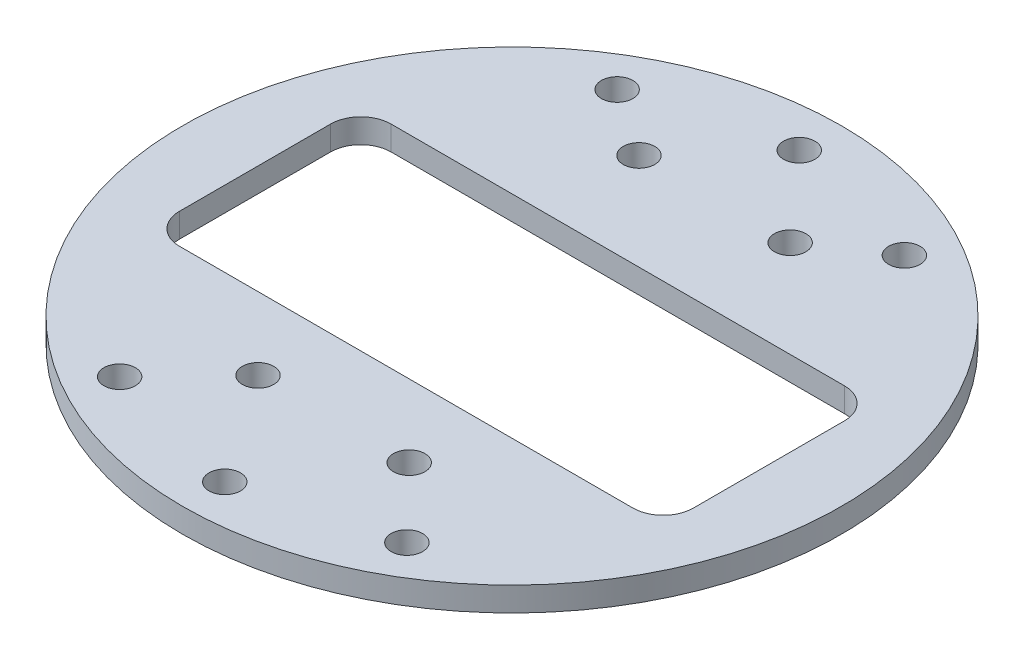
ISO-10303-21;
HEADER;
FILE_DESCRIPTION(('STEP AP214'),'2;1');
FILE_NAME('part.step','',(''),(''),'','','');
FILE_SCHEMA(('AUTOMOTIVE_DESIGN { 1 0 10303 214 1 1 1 1 }'));
ENDSEC;
DATA;
#1=APPLICATION_CONTEXT('core data for automotive mechanical design processes');
#2=APPLICATION_PROTOCOL_DEFINITION('international standard','automotive_design',2000,#1);
#3=PRODUCT_CONTEXT('',#1,'mechanical');
#4=PRODUCT('Part','Part','',(#3));
#5=PRODUCT_RELATED_PRODUCT_CATEGORY('part','',(#4));
#6=PRODUCT_DEFINITION_FORMATION('','',#4);
#7=PRODUCT_DEFINITION_CONTEXT('part definition',#1,'design');
#8=PRODUCT_DEFINITION('design','',#6,#7);
#9=PRODUCT_DEFINITION_SHAPE('','',#8);
#10=(LENGTH_UNIT() NAMED_UNIT(*) SI_UNIT(.MILLI.,.METRE.));
#11=(NAMED_UNIT(*) PLANE_ANGLE_UNIT() SI_UNIT($,.RADIAN.));
#12=(NAMED_UNIT(*) SI_UNIT($,.STERADIAN.) SOLID_ANGLE_UNIT());
#13=UNCERTAINTY_MEASURE_WITH_UNIT(LENGTH_MEASURE(1.E-05),#10,'distance_accuracy_value','');
#14=(GEOMETRIC_REPRESENTATION_CONTEXT(3) GLOBAL_UNCERTAINTY_ASSIGNED_CONTEXT((#13)) GLOBAL_UNIT_ASSIGNED_CONTEXT((#10,
#11,#12)) REPRESENTATION_CONTEXT('',''));
#15=CARTESIAN_POINT('',(0.,0.,0.));
#16=DIRECTION('',(0.,0.,1.));
#17=DIRECTION('',(1.,0.,0.));
#18=AXIS2_PLACEMENT_3D('',#15,#16,#17);
#19=CARTESIAN_POINT('',(0.,4.,0.));
#20=DIRECTION('',(0.,-1.,0.));
#21=DIRECTION('',(0.,0.,-1.));
#22=AXIS2_PLACEMENT_3D('',#19,#20,#21);
#23=CYLINDRICAL_SURFACE('',#22,54.5);
#24=CARTESIAN_POINT('',(0.,4.,0.));
#25=DIRECTION('',(0.,1.,0.));
#26=DIRECTION('',(0.,0.,1.));
#27=AXIS2_PLACEMENT_3D('',#24,#25,#26);
#28=CIRCLE('',#27,54.5);
#29=CARTESIAN_POINT('',(0.,4.,54.5));
#30=VERTEX_POINT('',#29);
#31=EDGE_CURVE('E139',#30,#30,#28,.T.);
#32=ORIENTED_EDGE('',*,*,#31,.F.);
#33=EDGE_LOOP('',(#32));
#34=FACE_BOUND('',#33,.T.);
#35=CARTESIAN_POINT('',(0.,0.,0.));
#36=DIRECTION('',(0.,1.,0.));
#37=DIRECTION('',(0.,0.,1.));
#38=AXIS2_PLACEMENT_3D('',#35,#36,#37);
#39=CIRCLE('',#38,54.5);
#40=CARTESIAN_POINT('',(0.,0.,54.5));
#41=VERTEX_POINT('',#40);
#42=EDGE_CURVE('E142',#41,#41,#39,.T.);
#43=ORIENTED_EDGE('',*,*,#42,.T.);
#44=EDGE_LOOP('',(#43));
#45=FACE_BOUND('',#44,.T.);
#46=ADVANCED_FACE('F38',(#34,#45),#23,.T.);
#47=CARTESIAN_POINT('',(0.,4.,0.));
#48=DIRECTION('',(0.,1.,0.));
#49=DIRECTION('',(0.,0.,1.));
#50=AXIS2_PLACEMENT_3D('',#47,#48,#49);
#51=PLANE('',#50);
#52=CARTESIAN_POINT('',(-12.5,4.,-33.5));
#53=DIRECTION('',(0.,1.,0.));
#54=DIRECTION('',(0.,0.,1.));
#55=AXIS2_PLACEMENT_3D('',#52,#53,#54);
#56=CIRCLE('',#55,2.6);
#57=CARTESIAN_POINT('',(-12.5,4.,-30.9));
#58=VERTEX_POINT('',#57);
#59=EDGE_CURVE('E236',#58,#58,#56,.T.);
#60=ORIENTED_EDGE('',*,*,#59,.F.);
#61=EDGE_LOOP('',(#60));
#62=FACE_BOUND('',#61,.T.);
#63=CARTESIAN_POINT('',(12.5,4.,-33.5));
#64=DIRECTION('',(0.,1.,0.));
#65=DIRECTION('',(0.,0.,1.));
#66=AXIS2_PLACEMENT_3D('',#63,#64,#65);
#67=CIRCLE('',#66,2.6);
#68=CARTESIAN_POINT('',(12.5,4.,-30.9));
#69=VERTEX_POINT('',#68);
#70=EDGE_CURVE('E241',#69,#69,#67,.T.);
#71=ORIENTED_EDGE('',*,*,#70,.F.);
#72=EDGE_LOOP('',(#71));
#73=FACE_BOUND('',#72,.T.);
#74=CARTESIAN_POINT('',(-12.5000000000001,4.,29.5));
#75=DIRECTION('',(0.,1.,0.));
#76=DIRECTION('',(0.,0.,1.));
#77=AXIS2_PLACEMENT_3D('',#74,#75,#76);
#78=CIRCLE('',#77,2.6);
#79=CARTESIAN_POINT('',(-12.5000000000001,4.,32.1));
#80=VERTEX_POINT('',#79);
#81=EDGE_CURVE('E222',#80,#80,#78,.T.);
#82=ORIENTED_EDGE('',*,*,#81,.F.);
#83=EDGE_LOOP('',(#82));
#84=FACE_BOUND('',#83,.T.);
#85=CARTESIAN_POINT('',(12.4999999999999,4.,29.5));
#86=DIRECTION('',(0.,1.,0.));
#87=DIRECTION('',(0.,0.,1.));
#88=AXIS2_PLACEMENT_3D('',#85,#86,#87);
#89=CIRCLE('',#88,2.6);
#90=CARTESIAN_POINT('',(12.4999999999999,4.,32.1));
#91=VERTEX_POINT('',#90);
#92=EDGE_CURVE('E229',#91,#91,#89,.T.);
#93=ORIENTED_EDGE('',*,*,#92,.F.);
#94=EDGE_LOOP('',(#93));
#95=FACE_BOUND('',#94,.T.);
#96=CARTESIAN_POINT('',(23.7499999999999,4.,-41.1362066797609));
#97=DIRECTION('',(0.,1.,0.));
#98=DIRECTION('',(0.,0.,1.));
#99=AXIS2_PLACEMENT_3D('',#96,#97,#98);
#100=CIRCLE('',#99,2.6);
#101=CARTESIAN_POINT('',(23.7499999999999,4.,-38.5362066797609));
#102=VERTEX_POINT('',#101);
#103=EDGE_CURVE('E204',#102,#102,#100,.T.);
#104=ORIENTED_EDGE('',*,*,#103,.F.);
#105=EDGE_LOOP('',(#104));
#106=FACE_BOUND('',#105,.T.);
#107=CARTESIAN_POINT('',(0.,4.,-47.5));
#108=DIRECTION('',(0.,1.,0.));
#109=DIRECTION('',(0.,0.,1.));
#110=AXIS2_PLACEMENT_3D('',#107,#108,#109);
#111=CIRCLE('',#110,2.6);
#112=CARTESIAN_POINT('',(0.,4.,-44.9));
#113=VERTEX_POINT('',#112);
#114=EDGE_CURVE('E211',#113,#113,#111,.T.);
#115=ORIENTED_EDGE('',*,*,#114,.F.);
#116=EDGE_LOOP('',(#115));
#117=FACE_BOUND('',#116,.T.);
#118=CARTESIAN_POINT('',(-23.7499999999999,4.,-41.1362066797609));
#119=DIRECTION('',(0.,1.,0.));
#120=DIRECTION('',(0.,0.,1.));
#121=AXIS2_PLACEMENT_3D('',#118,#119,#120);
#122=CIRCLE('',#121,2.6);
#123=CARTESIAN_POINT('',(-23.7499999999999,4.,-38.5362066797609));
#124=VERTEX_POINT('',#123);
#125=EDGE_CURVE('E214',#124,#124,#122,.T.);
#126=ORIENTED_EDGE('',*,*,#125,.F.);
#127=EDGE_LOOP('',(#126));
#128=FACE_BOUND('',#127,.T.);
#129=CARTESIAN_POINT('',(-23.7499999999999,4.,41.1362066797609));
#130=DIRECTION('',(0.,1.,0.));
#131=DIRECTION('',(0.,0.,1.));
#132=AXIS2_PLACEMENT_3D('',#129,#130,#131);
#133=CIRCLE('',#132,2.6);
#134=CARTESIAN_POINT('',(-23.7499999999999,4.,43.7362066797609));
#135=VERTEX_POINT('',#134);
#136=EDGE_CURVE('E187',#135,#135,#133,.T.);
#137=ORIENTED_EDGE('',*,*,#136,.F.);
#138=EDGE_LOOP('',(#137));
#139=FACE_BOUND('',#138,.T.);
#140=CARTESIAN_POINT('',(0.,4.,47.5));
#141=DIRECTION('',(0.,1.,0.));
#142=DIRECTION('',(0.,0.,1.));
#143=AXIS2_PLACEMENT_3D('',#140,#141,#142);
#144=CIRCLE('',#143,2.6);
#145=CARTESIAN_POINT('',(0.,4.,50.1));
#146=VERTEX_POINT('',#145);
#147=EDGE_CURVE('E189',#146,#146,#144,.T.);
#148=ORIENTED_EDGE('',*,*,#147,.F.);
#149=EDGE_LOOP('',(#148));
#150=FACE_BOUND('',#149,.T.);
#151=CARTESIAN_POINT('',(23.7499999999999,4.,41.1362066797609));
#152=DIRECTION('',(0.,1.,0.));
#153=DIRECTION('',(0.,0.,1.));
#154=AXIS2_PLACEMENT_3D('',#151,#152,#153);
#155=CIRCLE('',#154,2.6);
#156=CARTESIAN_POINT('',(23.7499999999999,4.,43.7362066797609));
#157=VERTEX_POINT('',#156);
#158=EDGE_CURVE('E194',#157,#157,#155,.T.);
#159=ORIENTED_EDGE('',*,*,#158,.F.);
#160=EDGE_LOOP('',(#159));
#161=FACE_BOUND('',#160,.T.);
#162=DIRECTION('',(0.,0.,-1.));
#163=VECTOR('',#162,1.);
#164=CARTESIAN_POINT('',(42.5,4.,-17.5));
#165=LINE('',#164,#163);
#166=CARTESIAN_POINT('',(42.5,4.,12.5));
#167=VERTEX_POINT('',#166);
#168=CARTESIAN_POINT('',(42.5,4.,-12.5));
#169=VERTEX_POINT('',#168);
#170=EDGE_CURVE('E174',#167,#169,#165,.T.);
#171=ORIENTED_EDGE('',*,*,#170,.F.);
#172=CARTESIAN_POINT('',(37.5,4.,12.5));
#173=DIRECTION('',(0.,1.,0.));
#174=DIRECTION('',(0.,0.,1.));
#175=AXIS2_PLACEMENT_3D('',#172,#173,#174);
#176=CIRCLE('',#175,5.);
#177=CARTESIAN_POINT('',(37.5,4.,17.5));
#178=VERTEX_POINT('',#177);
#179=EDGE_CURVE('E129',#167,#178,#176,.F.);
#180=ORIENTED_EDGE('',*,*,#179,.T.);
#181=DIRECTION('',(1.,0.,0.));
#182=VECTOR('',#181,1.);
#183=CARTESIAN_POINT('',(-42.5,4.,17.5));
#184=LINE('',#183,#182);
#185=CARTESIAN_POINT('',(-37.5,4.,17.5));
#186=VERTEX_POINT('',#185);
#187=EDGE_CURVE('E120',#186,#178,#184,.T.);
#188=ORIENTED_EDGE('',*,*,#187,.F.);
#189=CARTESIAN_POINT('',(-37.5,4.,12.5));
#190=DIRECTION('',(0.,1.,0.));
#191=DIRECTION('',(0.,0.,1.));
#192=AXIS2_PLACEMENT_3D('',#189,#190,#191);
#193=CIRCLE('',#192,5.);
#194=CARTESIAN_POINT('',(-42.5,4.,12.5));
#195=VERTEX_POINT('',#194);
#196=EDGE_CURVE('E104',#186,#195,#193,.F.);
#197=ORIENTED_EDGE('',*,*,#196,.T.);
#198=DIRECTION('',(0.,0.,1.));
#199=VECTOR('',#198,1.);
#200=CARTESIAN_POINT('',(-42.5,4.,-17.5));
#201=LINE('',#200,#199);
#202=CARTESIAN_POINT('',(-42.5,4.,-12.5));
#203=VERTEX_POINT('',#202);
#204=EDGE_CURVE('E131',#203,#195,#201,.T.);
#205=ORIENTED_EDGE('',*,*,#204,.F.);
#206=CARTESIAN_POINT('',(-37.5,4.,-12.5));
#207=DIRECTION('',(0.,1.,0.));
#208=DIRECTION('',(0.,0.,1.));
#209=AXIS2_PLACEMENT_3D('',#206,#207,#208);
#210=CIRCLE('',#209,5.);
#211=CARTESIAN_POINT('',(-37.5,4.,-17.5));
#212=VERTEX_POINT('',#211);
#213=EDGE_CURVE('E46',#203,#212,#210,.F.);
#214=ORIENTED_EDGE('',*,*,#213,.T.);
#215=DIRECTION('',(-1.,0.,0.));
#216=VECTOR('',#215,1.);
#217=CARTESIAN_POINT('',(-42.5,4.,-17.5));
#218=LINE('',#217,#216);
#219=CARTESIAN_POINT('',(37.5,4.,-17.5));
#220=VERTEX_POINT('',#219);
#221=EDGE_CURVE('E135',#220,#212,#218,.T.);
#222=ORIENTED_EDGE('',*,*,#221,.F.);
#223=CARTESIAN_POINT('',(37.5,4.,-12.5));
#224=DIRECTION('',(0.,1.,0.));
#225=DIRECTION('',(0.,0.,1.));
#226=AXIS2_PLACEMENT_3D('',#223,#224,#225);
#227=CIRCLE('',#226,5.);
#228=EDGE_CURVE('E159',#220,#169,#227,.F.);
#229=ORIENTED_EDGE('',*,*,#228,.T.);
#230=EDGE_LOOP('',(#171,#180,#188,#197,#205,#214,#222,#229));
#231=FACE_BOUND('',#230,.T.);
#232=ORIENTED_EDGE('',*,*,#31,.T.);
#233=EDGE_LOOP('',(#232));
#234=FACE_BOUND('',#233,.T.);
#235=ADVANCED_FACE('F127',(#62,#73,#84,#95,#106,#117,#128,#139,#150,#161,#231,#234),#51,.T.);
#236=CARTESIAN_POINT('',(0.,0.,0.));
#237=DIRECTION('',(0.,1.,0.));
#238=DIRECTION('',(0.,0.,1.));
#239=AXIS2_PLACEMENT_3D('',#236,#237,#238);
#240=PLANE('',#239);
#241=CARTESIAN_POINT('',(-12.5,0.,-33.5));
#242=DIRECTION('',(0.,-1.,0.));
#243=DIRECTION('',(0.,0.,-1.));
#244=AXIS2_PLACEMENT_3D('',#241,#242,#243);
#245=CIRCLE('',#244,2.6);
#246=CARTESIAN_POINT('',(-12.5,0.,-36.1));
#247=VERTEX_POINT('',#246);
#248=EDGE_CURVE('E244',#247,#247,#245,.T.);
#249=ORIENTED_EDGE('',*,*,#248,.F.);
#250=EDGE_LOOP('',(#249));
#251=FACE_BOUND('',#250,.T.);
#252=CARTESIAN_POINT('',(12.5,0.,-33.5));
#253=DIRECTION('',(0.,-1.,0.));
#254=DIRECTION('',(0.,0.,-1.));
#255=AXIS2_PLACEMENT_3D('',#252,#253,#254);
#256=CIRCLE('',#255,2.6);
#257=CARTESIAN_POINT('',(12.5,0.,-36.1));
#258=VERTEX_POINT('',#257);
#259=EDGE_CURVE('E245',#258,#258,#256,.T.);
#260=ORIENTED_EDGE('',*,*,#259,.F.);
#261=EDGE_LOOP('',(#260));
#262=FACE_BOUND('',#261,.T.);
#263=CARTESIAN_POINT('',(-12.5000000000001,0.,29.5));
#264=DIRECTION('',(0.,-1.,0.));
#265=DIRECTION('',(0.,0.,-1.));
#266=AXIS2_PLACEMENT_3D('',#263,#264,#265);
#267=CIRCLE('',#266,2.6);
#268=CARTESIAN_POINT('',(-12.5000000000001,0.,26.9));
#269=VERTEX_POINT('',#268);
#270=EDGE_CURVE('E232',#269,#269,#267,.T.);
#271=ORIENTED_EDGE('',*,*,#270,.F.);
#272=EDGE_LOOP('',(#271));
#273=FACE_BOUND('',#272,.T.);
#274=CARTESIAN_POINT('',(12.4999999999999,0.,29.5));
#275=DIRECTION('',(0.,-1.,0.));
#276=DIRECTION('',(0.,0.,-1.));
#277=AXIS2_PLACEMENT_3D('',#274,#275,#276);
#278=CIRCLE('',#277,2.6);
#279=CARTESIAN_POINT('',(12.4999999999999,0.,26.9));
#280=VERTEX_POINT('',#279);
#281=EDGE_CURVE('E233',#280,#280,#278,.T.);
#282=ORIENTED_EDGE('',*,*,#281,.F.);
#283=EDGE_LOOP('',(#282));
#284=FACE_BOUND('',#283,.T.);
#285=CARTESIAN_POINT('',(23.7499999999999,0.,-41.1362066797609));
#286=DIRECTION('',(0.,-1.,0.));
#287=DIRECTION('',(0.,0.,1.));
#288=AXIS2_PLACEMENT_3D('',#285,#286,#287);
#289=CIRCLE('',#288,2.6);
#290=CARTESIAN_POINT('',(23.7499999999999,0.,-38.5362066797609));
#291=VERTEX_POINT('',#290);
#292=EDGE_CURVE('E217',#291,#291,#289,.T.);
#293=ORIENTED_EDGE('',*,*,#292,.F.);
#294=EDGE_LOOP('',(#293));
#295=FACE_BOUND('',#294,.T.);
#296=CARTESIAN_POINT('',(0.,0.,-47.5));
#297=DIRECTION('',(0.,-1.,0.));
#298=DIRECTION('',(0.,0.,1.));
#299=AXIS2_PLACEMENT_3D('',#296,#297,#298);
#300=CIRCLE('',#299,2.6);
#301=CARTESIAN_POINT('',(0.,0.,-44.9));
#302=VERTEX_POINT('',#301);
#303=EDGE_CURVE('E221',#302,#302,#300,.T.);
#304=ORIENTED_EDGE('',*,*,#303,.F.);
#305=EDGE_LOOP('',(#304));
#306=FACE_BOUND('',#305,.T.);
#307=CARTESIAN_POINT('',(-23.7499999999999,0.,-41.1362066797609));
#308=DIRECTION('',(0.,-1.,0.));
#309=DIRECTION('',(0.,0.,1.));
#310=AXIS2_PLACEMENT_3D('',#307,#308,#309);
#311=CIRCLE('',#310,2.6);
#312=CARTESIAN_POINT('',(-23.7499999999999,0.,-38.5362066797609));
#313=VERTEX_POINT('',#312);
#314=EDGE_CURVE('E218',#313,#313,#311,.T.);
#315=ORIENTED_EDGE('',*,*,#314,.F.);
#316=EDGE_LOOP('',(#315));
#317=FACE_BOUND('',#316,.T.);
#318=CARTESIAN_POINT('',(-23.7499999999999,0.,41.1362066797609));
#319=DIRECTION('',(0.,-1.,0.));
#320=DIRECTION('',(0.,0.,-1.));
#321=AXIS2_PLACEMENT_3D('',#318,#319,#320);
#322=CIRCLE('',#321,2.6);
#323=CARTESIAN_POINT('',(-23.7499999999999,0.,38.5362066797609));
#324=VERTEX_POINT('',#323);
#325=EDGE_CURVE('E199',#324,#324,#322,.T.);
#326=ORIENTED_EDGE('',*,*,#325,.F.);
#327=EDGE_LOOP('',(#326));
#328=FACE_BOUND('',#327,.T.);
#329=CARTESIAN_POINT('',(0.,0.,47.5));
#330=DIRECTION('',(0.,-1.,0.));
#331=DIRECTION('',(0.,0.,-1.));
#332=AXIS2_PLACEMENT_3D('',#329,#330,#331);
#333=CIRCLE('',#332,2.6);
#334=CARTESIAN_POINT('',(0.,0.,44.9));
#335=VERTEX_POINT('',#334);
#336=EDGE_CURVE('E203',#335,#335,#333,.T.);
#337=ORIENTED_EDGE('',*,*,#336,.F.);
#338=EDGE_LOOP('',(#337));
#339=FACE_BOUND('',#338,.T.);
#340=CARTESIAN_POINT('',(23.7499999999999,0.,41.1362066797609));
#341=DIRECTION('',(0.,-1.,0.));
#342=DIRECTION('',(0.,0.,-1.));
#343=AXIS2_PLACEMENT_3D('',#340,#341,#342);
#344=CIRCLE('',#343,2.6);
#345=CARTESIAN_POINT('',(23.7499999999999,0.,38.5362066797609));
#346=VERTEX_POINT('',#345);
#347=EDGE_CURVE('E200',#346,#346,#344,.T.);
#348=ORIENTED_EDGE('',*,*,#347,.F.);
#349=EDGE_LOOP('',(#348));
#350=FACE_BOUND('',#349,.T.);
#351=DIRECTION('',(0.,0.,1.));
#352=VECTOR('',#351,1.);
#353=CARTESIAN_POINT('',(-42.5,0.,-17.5));
#354=LINE('',#353,#352);
#355=CARTESIAN_POINT('',(-42.5,0.,-12.5));
#356=VERTEX_POINT('',#355);
#357=CARTESIAN_POINT('',(-42.5,0.,12.5));
#358=VERTEX_POINT('',#357);
#359=EDGE_CURVE('E180',#356,#358,#354,.T.);
#360=ORIENTED_EDGE('',*,*,#359,.T.);
#361=CARTESIAN_POINT('',(-37.5,0.,12.5));
#362=DIRECTION('',(0.,1.,0.));
#363=DIRECTION('',(0.,0.,1.));
#364=AXIS2_PLACEMENT_3D('',#361,#362,#363);
#365=CIRCLE('',#364,5.);
#366=CARTESIAN_POINT('',(-37.5,0.,17.5));
#367=VERTEX_POINT('',#366);
#368=EDGE_CURVE('E114',#358,#367,#365,.T.);
#369=ORIENTED_EDGE('',*,*,#368,.T.);
#370=DIRECTION('',(1.,0.,0.));
#371=VECTOR('',#370,1.);
#372=CARTESIAN_POINT('',(-42.5,0.,17.5));
#373=LINE('',#372,#371);
#374=CARTESIAN_POINT('',(37.5,0.,17.5));
#375=VERTEX_POINT('',#374);
#376=EDGE_CURVE('E122',#367,#375,#373,.T.);
#377=ORIENTED_EDGE('',*,*,#376,.T.);
#378=CARTESIAN_POINT('',(37.5,0.,12.5));
#379=DIRECTION('',(0.,1.,0.));
#380=DIRECTION('',(0.,0.,1.));
#381=AXIS2_PLACEMENT_3D('',#378,#379,#380);
#382=CIRCLE('',#381,5.);
#383=CARTESIAN_POINT('',(42.5,0.,12.5));
#384=VERTEX_POINT('',#383);
#385=EDGE_CURVE('E60',#375,#384,#382,.T.);
#386=ORIENTED_EDGE('',*,*,#385,.T.);
#387=DIRECTION('',(0.,0.,-1.));
#388=VECTOR('',#387,1.);
#389=CARTESIAN_POINT('',(42.5,0.,-17.5));
#390=LINE('',#389,#388);
#391=CARTESIAN_POINT('',(42.5,0.,-12.5));
#392=VERTEX_POINT('',#391);
#393=EDGE_CURVE('E130',#384,#392,#390,.T.);
#394=ORIENTED_EDGE('',*,*,#393,.T.);
#395=CARTESIAN_POINT('',(37.5,0.,-12.5));
#396=DIRECTION('',(0.,1.,0.));
#397=DIRECTION('',(0.,0.,1.));
#398=AXIS2_PLACEMENT_3D('',#395,#396,#397);
#399=CIRCLE('',#398,5.);
#400=CARTESIAN_POINT('',(37.5,0.,-17.5));
#401=VERTEX_POINT('',#400);
#402=EDGE_CURVE('E161',#392,#401,#399,.T.);
#403=ORIENTED_EDGE('',*,*,#402,.T.);
#404=DIRECTION('',(-1.,0.,0.));
#405=VECTOR('',#404,1.);
#406=CARTESIAN_POINT('',(-42.5,0.,-17.5));
#407=LINE('',#406,#405);
#408=CARTESIAN_POINT('',(-37.5,0.,-17.5));
#409=VERTEX_POINT('',#408);
#410=EDGE_CURVE('E133',#401,#409,#407,.T.);
#411=ORIENTED_EDGE('',*,*,#410,.T.);
#412=CARTESIAN_POINT('',(-37.5,0.,-12.5));
#413=DIRECTION('',(0.,1.,0.));
#414=DIRECTION('',(0.,0.,1.));
#415=AXIS2_PLACEMENT_3D('',#412,#413,#414);
#416=CIRCLE('',#415,5.);
#417=EDGE_CURVE('E12',#409,#356,#416,.T.);
#418=ORIENTED_EDGE('',*,*,#417,.T.);
#419=EDGE_LOOP('',(#360,#369,#377,#386,#394,#403,#411,#418));
#420=FACE_BOUND('',#419,.T.);
#421=ORIENTED_EDGE('',*,*,#42,.F.);
#422=EDGE_LOOP('',(#421));
#423=FACE_BOUND('',#422,.T.);
#424=ADVANCED_FACE('F178',(#251,#262,#273,#284,#295,#306,#317,#328,#339,#350,#420,#423),#240,.F.);
#425=CARTESIAN_POINT('',(42.5,0.,-17.5));
#426=DIRECTION('',(1.,0.,0.));
#427=DIRECTION('',(0.,0.,-1.));
#428=AXIS2_PLACEMENT_3D('',#425,#426,#427);
#429=PLANE('',#428);
#430=ORIENTED_EDGE('',*,*,#170,.T.);
#431=DIRECTION('',(0.,1.,0.));
#432=VECTOR('',#431,1.);
#433=CARTESIAN_POINT('',(42.5,0.,-12.5));
#434=LINE('',#433,#432);
#435=EDGE_CURVE('E53',#169,#392,#434,.F.);
#436=ORIENTED_EDGE('',*,*,#435,.T.);
#437=ORIENTED_EDGE('',*,*,#393,.F.);
#438=DIRECTION('',(0.,1.,0.));
#439=VECTOR('',#438,1.);
#440=CARTESIAN_POINT('',(42.5,4.,12.5));
#441=LINE('',#440,#439);
#442=EDGE_CURVE('E154',#384,#167,#441,.T.);
#443=ORIENTED_EDGE('',*,*,#442,.T.);
#444=EDGE_LOOP('',(#430,#436,#437,#443));
#445=FACE_BOUND('',#444,.T.);
#446=ADVANCED_FACE('F255',(#445),#429,.F.);
#447=CARTESIAN_POINT('',(-42.5,0.,17.5));
#448=DIRECTION('',(0.,0.,1.));
#449=DIRECTION('',(1.,0.,0.));
#450=AXIS2_PLACEMENT_3D('',#447,#448,#449);
#451=PLANE('',#450);
#452=ORIENTED_EDGE('',*,*,#376,.F.);
#453=DIRECTION('',(0.,1.,0.));
#454=VECTOR('',#453,1.);
#455=CARTESIAN_POINT('',(-37.5,4.,17.5));
#456=LINE('',#455,#454);
#457=EDGE_CURVE('E108',#367,#186,#456,.T.);
#458=ORIENTED_EDGE('',*,*,#457,.T.);
#459=ORIENTED_EDGE('',*,*,#187,.T.);
#460=DIRECTION('',(0.,1.,0.));
#461=VECTOR('',#460,1.);
#462=CARTESIAN_POINT('',(37.5,0.,17.5));
#463=LINE('',#462,#461);
#464=EDGE_CURVE('E124',#178,#375,#463,.F.);
#465=ORIENTED_EDGE('',*,*,#464,.T.);
#466=EDGE_LOOP('',(#452,#458,#459,#465));
#467=FACE_BOUND('',#466,.T.);
#468=ADVANCED_FACE('F119',(#467),#451,.F.);
#469=CARTESIAN_POINT('',(-42.5,0.,-17.5));
#470=DIRECTION('',(-1.,0.,0.));
#471=DIRECTION('',(0.,0.,1.));
#472=AXIS2_PLACEMENT_3D('',#469,#470,#471);
#473=PLANE('',#472);
#474=ORIENTED_EDGE('',*,*,#204,.T.);
#475=DIRECTION('',(0.,1.,0.));
#476=VECTOR('',#475,1.);
#477=CARTESIAN_POINT('',(-42.5,0.,12.5));
#478=LINE('',#477,#476);
#479=EDGE_CURVE('E109',#195,#358,#478,.F.);
#480=ORIENTED_EDGE('',*,*,#479,.T.);
#481=ORIENTED_EDGE('',*,*,#359,.F.);
#482=DIRECTION('',(0.,1.,0.));
#483=VECTOR('',#482,1.);
#484=CARTESIAN_POINT('',(-42.5,4.,-12.5));
#485=LINE('',#484,#483);
#486=EDGE_CURVE('E123',#356,#203,#485,.T.);
#487=ORIENTED_EDGE('',*,*,#486,.T.);
#488=EDGE_LOOP('',(#474,#480,#481,#487));
#489=FACE_BOUND('',#488,.T.);
#490=ADVANCED_FACE('F182',(#489),#473,.F.);
#491=CARTESIAN_POINT('',(-42.5,0.,-17.5));
#492=DIRECTION('',(0.,0.,-1.));
#493=DIRECTION('',(-1.,0.,0.));
#494=AXIS2_PLACEMENT_3D('',#491,#492,#493);
#495=PLANE('',#494);
#496=ORIENTED_EDGE('',*,*,#410,.F.);
#497=DIRECTION('',(0.,1.,0.));
#498=VECTOR('',#497,1.);
#499=CARTESIAN_POINT('',(37.5,4.,-17.5));
#500=LINE('',#499,#498);
#501=EDGE_CURVE('E151',#401,#220,#500,.T.);
#502=ORIENTED_EDGE('',*,*,#501,.T.);
#503=ORIENTED_EDGE('',*,*,#221,.T.);
#504=DIRECTION('',(0.,1.,0.));
#505=VECTOR('',#504,1.);
#506=CARTESIAN_POINT('',(-37.5,0.,-17.5));
#507=LINE('',#506,#505);
#508=EDGE_CURVE('E149',#212,#409,#507,.F.);
#509=ORIENTED_EDGE('',*,*,#508,.T.);
#510=EDGE_LOOP('',(#496,#502,#503,#509));
#511=FACE_BOUND('',#510,.T.);
#512=ADVANCED_FACE('F171',(#511),#495,.F.);
#513=CARTESIAN_POINT('',(-37.5,0.,12.5));
#514=DIRECTION('',(0.,-1.,0.));
#515=DIRECTION('',(0.,0.,-1.));
#516=AXIS2_PLACEMENT_3D('',#513,#514,#515);
#517=CYLINDRICAL_SURFACE('',#516,5.);
#518=ORIENTED_EDGE('',*,*,#368,.F.);
#519=ORIENTED_EDGE('',*,*,#479,.F.);
#520=ORIENTED_EDGE('',*,*,#196,.F.);
#521=ORIENTED_EDGE('',*,*,#457,.F.);
#522=EDGE_LOOP('',(#518,#519,#520,#521));
#523=FACE_BOUND('',#522,.T.);
#524=ADVANCED_FACE('F107',(#523),#517,.F.);
#525=CARTESIAN_POINT('',(37.5,0.,-12.5));
#526=DIRECTION('',(0.,-1.,0.));
#527=DIRECTION('',(0.,0.,-1.));
#528=AXIS2_PLACEMENT_3D('',#525,#526,#527);
#529=CYLINDRICAL_SURFACE('',#528,5.);
#530=ORIENTED_EDGE('',*,*,#402,.F.);
#531=ORIENTED_EDGE('',*,*,#435,.F.);
#532=ORIENTED_EDGE('',*,*,#228,.F.);
#533=ORIENTED_EDGE('',*,*,#501,.F.);
#534=EDGE_LOOP('',(#530,#531,#532,#533));
#535=FACE_BOUND('',#534,.T.);
#536=ADVANCED_FACE('F303',(#535),#529,.F.);
#537=CARTESIAN_POINT('',(37.5,0.,12.5));
#538=DIRECTION('',(0.,-1.,0.));
#539=DIRECTION('',(0.,0.,-1.));
#540=AXIS2_PLACEMENT_3D('',#537,#538,#539);
#541=CYLINDRICAL_SURFACE('',#540,5.);
#542=ORIENTED_EDGE('',*,*,#385,.F.);
#543=ORIENTED_EDGE('',*,*,#464,.F.);
#544=ORIENTED_EDGE('',*,*,#179,.F.);
#545=ORIENTED_EDGE('',*,*,#442,.F.);
#546=EDGE_LOOP('',(#542,#543,#544,#545));
#547=FACE_BOUND('',#546,.T.);
#548=ADVANCED_FACE('F287',(#547),#541,.F.);
#549=CARTESIAN_POINT('',(-37.5,0.,-12.5));
#550=DIRECTION('',(0.,-1.,0.));
#551=DIRECTION('',(0.,0.,-1.));
#552=AXIS2_PLACEMENT_3D('',#549,#550,#551);
#553=CYLINDRICAL_SURFACE('',#552,5.);
#554=ORIENTED_EDGE('',*,*,#417,.F.);
#555=ORIENTED_EDGE('',*,*,#508,.F.);
#556=ORIENTED_EDGE('',*,*,#213,.F.);
#557=ORIENTED_EDGE('',*,*,#486,.F.);
#558=EDGE_LOOP('',(#554,#555,#556,#557));
#559=FACE_BOUND('',#558,.T.);
#560=ADVANCED_FACE('F40',(#559),#553,.F.);
#561=CARTESIAN_POINT('',(23.7499999999999,10.,41.1362066797609));
#562=DIRECTION('',(0.,-1.,0.));
#563=DIRECTION('',(0.,0.,-1.));
#564=AXIS2_PLACEMENT_3D('',#561,#562,#563);
#565=CYLINDRICAL_SURFACE('',#564,2.6);
#566=ORIENTED_EDGE('',*,*,#158,.T.);
#567=EDGE_LOOP('',(#566));
#568=FACE_BOUND('',#567,.T.);
#569=ORIENTED_EDGE('',*,*,#347,.T.);
#570=EDGE_LOOP('',(#569));
#571=FACE_BOUND('',#570,.T.);
#572=ADVANCED_FACE('F275',(#568,#571),#565,.F.);
#573=CARTESIAN_POINT('',(0.,10.,47.5));
#574=DIRECTION('',(0.,-1.,0.));
#575=DIRECTION('',(0.,0.,-1.));
#576=AXIS2_PLACEMENT_3D('',#573,#574,#575);
#577=CYLINDRICAL_SURFACE('',#576,2.6);
#578=ORIENTED_EDGE('',*,*,#147,.T.);
#579=EDGE_LOOP('',(#578));
#580=FACE_BOUND('',#579,.T.);
#581=ORIENTED_EDGE('',*,*,#336,.T.);
#582=EDGE_LOOP('',(#581));
#583=FACE_BOUND('',#582,.T.);
#584=ADVANCED_FACE('F277',(#580,#583),#577,.F.);
#585=CARTESIAN_POINT('',(-23.7499999999999,10.,41.1362066797609));
#586=DIRECTION('',(0.,-1.,0.));
#587=DIRECTION('',(0.,0.,-1.));
#588=AXIS2_PLACEMENT_3D('',#585,#586,#587);
#589=CYLINDRICAL_SURFACE('',#588,2.6);
#590=ORIENTED_EDGE('',*,*,#136,.T.);
#591=EDGE_LOOP('',(#590));
#592=FACE_BOUND('',#591,.T.);
#593=ORIENTED_EDGE('',*,*,#325,.T.);
#594=EDGE_LOOP('',(#593));
#595=FACE_BOUND('',#594,.T.);
#596=ADVANCED_FACE('F284',(#592,#595),#589,.F.);
#597=CARTESIAN_POINT('',(-23.7499999999999,10.,-41.1362066797609));
#598=DIRECTION('',(0.,-1.,0.));
#599=DIRECTION('',(0.,0.,-1.));
#600=AXIS2_PLACEMENT_3D('',#597,#598,#599);
#601=CYLINDRICAL_SURFACE('',#600,2.6);
#602=ORIENTED_EDGE('',*,*,#125,.T.);
#603=EDGE_LOOP('',(#602));
#604=FACE_BOUND('',#603,.T.);
#605=ORIENTED_EDGE('',*,*,#314,.T.);
#606=EDGE_LOOP('',(#605));
#607=FACE_BOUND('',#606,.T.);
#608=ADVANCED_FACE('F367',(#604,#607),#601,.F.);
#609=CARTESIAN_POINT('',(0.,10.,-47.5));
#610=DIRECTION('',(0.,-1.,0.));
#611=DIRECTION('',(0.,0.,-1.));
#612=AXIS2_PLACEMENT_3D('',#609,#610,#611);
#613=CYLINDRICAL_SURFACE('',#612,2.6);
#614=ORIENTED_EDGE('',*,*,#114,.T.);
#615=EDGE_LOOP('',(#614));
#616=FACE_BOUND('',#615,.T.);
#617=ORIENTED_EDGE('',*,*,#303,.T.);
#618=EDGE_LOOP('',(#617));
#619=FACE_BOUND('',#618,.T.);
#620=ADVANCED_FACE('F376',(#616,#619),#613,.F.);
#621=CARTESIAN_POINT('',(23.7499999999999,10.,-41.1362066797609));
#622=DIRECTION('',(0.,-1.,0.));
#623=DIRECTION('',(0.,0.,-1.));
#624=AXIS2_PLACEMENT_3D('',#621,#622,#623);
#625=CYLINDRICAL_SURFACE('',#624,2.6);
#626=ORIENTED_EDGE('',*,*,#103,.T.);
#627=EDGE_LOOP('',(#626));
#628=FACE_BOUND('',#627,.T.);
#629=ORIENTED_EDGE('',*,*,#292,.T.);
#630=EDGE_LOOP('',(#629));
#631=FACE_BOUND('',#630,.T.);
#632=ADVANCED_FACE('F386',(#628,#631),#625,.F.);
#633=CARTESIAN_POINT('',(12.4999999999999,10.,29.5));
#634=DIRECTION('',(0.,-1.,0.));
#635=DIRECTION('',(0.,0.,-1.));
#636=AXIS2_PLACEMENT_3D('',#633,#634,#635);
#637=CYLINDRICAL_SURFACE('',#636,2.6);
#638=ORIENTED_EDGE('',*,*,#92,.T.);
#639=EDGE_LOOP('',(#638));
#640=FACE_BOUND('',#639,.T.);
#641=ORIENTED_EDGE('',*,*,#281,.T.);
#642=EDGE_LOOP('',(#641));
#643=FACE_BOUND('',#642,.T.);
#644=ADVANCED_FACE('F396',(#640,#643),#637,.F.);
#645=CARTESIAN_POINT('',(-12.5000000000001,10.,29.5));
#646=DIRECTION('',(0.,-1.,0.));
#647=DIRECTION('',(0.,0.,-1.));
#648=AXIS2_PLACEMENT_3D('',#645,#646,#647);
#649=CYLINDRICAL_SURFACE('',#648,2.6);
#650=ORIENTED_EDGE('',*,*,#81,.T.);
#651=EDGE_LOOP('',(#650));
#652=FACE_BOUND('',#651,.T.);
#653=ORIENTED_EDGE('',*,*,#270,.T.);
#654=EDGE_LOOP('',(#653));
#655=FACE_BOUND('',#654,.T.);
#656=ADVANCED_FACE('F406',(#652,#655),#649,.F.);
#657=CARTESIAN_POINT('',(12.5,100.,-33.5));
#658=DIRECTION('',(0.,-1.,0.));
#659=DIRECTION('',(0.,0.,-1.));
#660=AXIS2_PLACEMENT_3D('',#657,#658,#659);
#661=CYLINDRICAL_SURFACE('',#660,2.6);
#662=ORIENTED_EDGE('',*,*,#70,.T.);
#663=EDGE_LOOP('',(#662));
#664=FACE_BOUND('',#663,.T.);
#665=ORIENTED_EDGE('',*,*,#259,.T.);
#666=EDGE_LOOP('',(#665));
#667=FACE_BOUND('',#666,.T.);
#668=ADVANCED_FACE('F415',(#664,#667),#661,.F.);
#669=CARTESIAN_POINT('',(-12.5,100.,-33.5));
#670=DIRECTION('',(0.,-1.,0.));
#671=DIRECTION('',(0.,0.,-1.));
#672=AXIS2_PLACEMENT_3D('',#669,#670,#671);
#673=CYLINDRICAL_SURFACE('',#672,2.6);
#674=ORIENTED_EDGE('',*,*,#59,.T.);
#675=EDGE_LOOP('',(#674));
#676=FACE_BOUND('',#675,.T.);
#677=ORIENTED_EDGE('',*,*,#248,.T.);
#678=EDGE_LOOP('',(#677));
#679=FACE_BOUND('',#678,.T.);
#680=ADVANCED_FACE('F251',(#676,#679),#673,.F.);
#681=CLOSED_SHELL('',(#46,#235,#424,#446,#468,#490,#512,#524,#536,#548,#560,#572,#584,#596,#608,
#620,#632,#644,#656,#668,#680));
#682=MANIFOLD_SOLID_BREP('B2',#681);
#683=ADVANCED_BREP_SHAPE_REPRESENTATION('',(#18,#682),#14);
#684=SHAPE_DEFINITION_REPRESENTATION(#9,#683);
ENDSEC;
END-ISO-10303-21;
